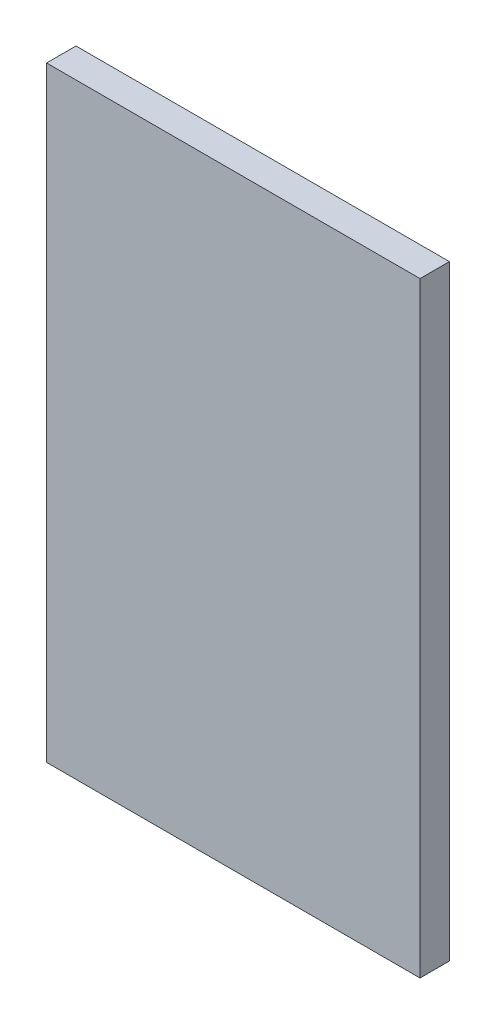
ISO-10303-21;
HEADER;
FILE_DESCRIPTION(('STEP AP214'),'2;1');
FILE_NAME('part.step','',(''),(''),'','','');
FILE_SCHEMA(('AUTOMOTIVE_DESIGN { 1 0 10303 214 1 1 1 1 }'));
ENDSEC;
DATA;
#1=APPLICATION_CONTEXT('core data for automotive mechanical design processes');
#2=APPLICATION_PROTOCOL_DEFINITION('international standard','automotive_design',2000,#1);
#3=PRODUCT_CONTEXT('',#1,'mechanical');
#4=PRODUCT('Part','Part','',(#3));
#5=PRODUCT_RELATED_PRODUCT_CATEGORY('part','',(#4));
#6=PRODUCT_DEFINITION_FORMATION('','',#4);
#7=PRODUCT_DEFINITION_CONTEXT('part definition',#1,'design');
#8=PRODUCT_DEFINITION('design','',#6,#7);
#9=PRODUCT_DEFINITION_SHAPE('','',#8);
#10=(LENGTH_UNIT() NAMED_UNIT(*) SI_UNIT(.MILLI.,.METRE.));
#11=(NAMED_UNIT(*) PLANE_ANGLE_UNIT() SI_UNIT($,.RADIAN.));
#12=(NAMED_UNIT(*) SI_UNIT($,.STERADIAN.) SOLID_ANGLE_UNIT());
#13=UNCERTAINTY_MEASURE_WITH_UNIT(LENGTH_MEASURE(1.E-05),#10,'distance_accuracy_value','');
#14=(GEOMETRIC_REPRESENTATION_CONTEXT(3) GLOBAL_UNCERTAINTY_ASSIGNED_CONTEXT((#13)) GLOBAL_UNIT_ASSIGNED_CONTEXT((#10,
#11,#12)) REPRESENTATION_CONTEXT('',''));
#15=CARTESIAN_POINT('',(0.,0.,0.));
#16=DIRECTION('',(0.,0.,1.));
#17=DIRECTION('',(1.,0.,0.));
#18=AXIS2_PLACEMENT_3D('',#15,#16,#17);
#19=CARTESIAN_POINT('',(216.5,-85.5,-80.));
#20=DIRECTION('',(0.,0.,1.));
#21=DIRECTION('',(1.,0.,0.));
#22=AXIS2_PLACEMENT_3D('',#19,#20,#21);
#23=PLANE('',#22);
#24=DIRECTION('',(0.,1.,0.));
#25=VECTOR('',#24,1.);
#26=CARTESIAN_POINT('',(216.5,-85.5,-80.));
#27=LINE('',#26,#25);
#28=CARTESIAN_POINT('',(216.5,-85.5,-80.));
#29=VERTEX_POINT('',#28);
#30=CARTESIAN_POINT('',(216.5,120.5,-80.));
#31=VERTEX_POINT('',#30);
#32=EDGE_CURVE('E84',#29,#31,#27,.T.);
#33=ORIENTED_EDGE('',*,*,#32,.F.);
#34=DIRECTION('',(1.,0.,0.));
#35=VECTOR('',#34,1.);
#36=CARTESIAN_POINT('',(216.5,-85.5,-80.));
#37=LINE('',#36,#35);
#38=CARTESIAN_POINT('',(343.5,-85.5,-80.));
#39=VERTEX_POINT('',#38);
#40=EDGE_CURVE('E68',#29,#39,#37,.T.);
#41=ORIENTED_EDGE('',*,*,#40,.T.);
#42=DIRECTION('',(0.,1.,0.));
#43=VECTOR('',#42,1.);
#44=CARTESIAN_POINT('',(343.5,-85.5,-80.));
#45=LINE('',#44,#43);
#46=CARTESIAN_POINT('',(343.5,120.5,-80.));
#47=VERTEX_POINT('',#46);
#48=EDGE_CURVE('E79',#39,#47,#45,.T.);
#49=ORIENTED_EDGE('',*,*,#48,.T.);
#50=DIRECTION('',(1.,0.,0.));
#51=VECTOR('',#50,1.);
#52=CARTESIAN_POINT('',(216.5,120.5,-80.));
#53=LINE('',#52,#51);
#54=EDGE_CURVE('E9',#31,#47,#53,.T.);
#55=ORIENTED_EDGE('',*,*,#54,.F.);
#56=EDGE_LOOP('',(#33,#41,#49,#55));
#57=FACE_BOUND('',#56,.T.);
#58=ADVANCED_FACE('F15',(#57),#23,.T.);
#59=CARTESIAN_POINT('',(216.5,-85.5,-90.));
#60=DIRECTION('',(0.,0.,1.));
#61=DIRECTION('',(1.,0.,0.));
#62=AXIS2_PLACEMENT_3D('',#59,#60,#61);
#63=PLANE('',#62);
#64=DIRECTION('',(1.,0.,0.));
#65=VECTOR('',#64,1.);
#66=CARTESIAN_POINT('',(216.5,120.5,-90.));
#67=LINE('',#66,#65);
#68=CARTESIAN_POINT('',(216.5,120.5,-90.));
#69=VERTEX_POINT('',#68);
#70=CARTESIAN_POINT('',(343.5,120.5,-90.));
#71=VERTEX_POINT('',#70);
#72=EDGE_CURVE('E23',#69,#71,#67,.T.);
#73=ORIENTED_EDGE('',*,*,#72,.T.);
#74=DIRECTION('',(0.,1.,0.));
#75=VECTOR('',#74,1.);
#76=CARTESIAN_POINT('',(343.5,-85.5,-90.));
#77=LINE('',#76,#75);
#78=CARTESIAN_POINT('',(343.5,-85.5,-90.));
#79=VERTEX_POINT('',#78);
#80=EDGE_CURVE('E101',#79,#71,#77,.T.);
#81=ORIENTED_EDGE('',*,*,#80,.F.);
#82=DIRECTION('',(1.,0.,0.));
#83=VECTOR('',#82,1.);
#84=CARTESIAN_POINT('',(216.5,-85.5,-90.));
#85=LINE('',#84,#83);
#86=CARTESIAN_POINT('',(216.5,-85.5,-90.));
#87=VERTEX_POINT('',#86);
#88=EDGE_CURVE('E78',#87,#79,#85,.T.);
#89=ORIENTED_EDGE('',*,*,#88,.F.);
#90=DIRECTION('',(0.,1.,0.));
#91=VECTOR('',#90,1.);
#92=CARTESIAN_POINT('',(216.5,-85.5,-90.));
#93=LINE('',#92,#91);
#94=EDGE_CURVE('E88',#87,#69,#93,.T.);
#95=ORIENTED_EDGE('',*,*,#94,.T.);
#96=EDGE_LOOP('',(#73,#81,#89,#95));
#97=FACE_BOUND('',#96,.T.);
#98=ADVANCED_FACE('F120',(#97),#63,.F.);
#99=CARTESIAN_POINT('',(216.5,120.5,-90.));
#100=DIRECTION('',(0.,1.,0.));
#101=DIRECTION('',(1.,0.,0.));
#102=AXIS2_PLACEMENT_3D('',#99,#100,#101);
#103=PLANE('',#102);
#104=ORIENTED_EDGE('',*,*,#72,.F.);
#105=DIRECTION('',(0.,0.,1.));
#106=VECTOR('',#105,1.);
#107=CARTESIAN_POINT('',(216.5,120.5,-90.));
#108=LINE('',#107,#106);
#109=EDGE_CURVE('E89',#69,#31,#108,.T.);
#110=ORIENTED_EDGE('',*,*,#109,.T.);
#111=ORIENTED_EDGE('',*,*,#54,.T.);
#112=DIRECTION('',(0.,0.,1.));
#113=VECTOR('',#112,1.);
#114=CARTESIAN_POINT('',(343.5,120.5,-90.));
#115=LINE('',#114,#113);
#116=EDGE_CURVE('E99',#71,#47,#115,.T.);
#117=ORIENTED_EDGE('',*,*,#116,.F.);
#118=EDGE_LOOP('',(#104,#110,#111,#117));
#119=FACE_BOUND('',#118,.T.);
#120=ADVANCED_FACE('F124',(#119),#103,.T.);
#121=CARTESIAN_POINT('',(216.5,-85.5,-90.));
#122=DIRECTION('',(0.,1.,0.));
#123=DIRECTION('',(1.,0.,0.));
#124=AXIS2_PLACEMENT_3D('',#121,#122,#123);
#125=PLANE('',#124);
#126=DIRECTION('',(0.,0.,1.));
#127=VECTOR('',#126,1.);
#128=CARTESIAN_POINT('',(343.5,-85.5,-90.));
#129=LINE('',#128,#127);
#130=EDGE_CURVE('E72',#79,#39,#129,.T.);
#131=ORIENTED_EDGE('',*,*,#130,.T.);
#132=ORIENTED_EDGE('',*,*,#40,.F.);
#133=DIRECTION('',(0.,0.,1.));
#134=VECTOR('',#133,1.);
#135=CARTESIAN_POINT('',(216.5,-85.5,-90.));
#136=LINE('',#135,#134);
#137=EDGE_CURVE('E75',#87,#29,#136,.T.);
#138=ORIENTED_EDGE('',*,*,#137,.F.);
#139=ORIENTED_EDGE('',*,*,#88,.T.);
#140=EDGE_LOOP('',(#131,#132,#138,#139));
#141=FACE_BOUND('',#140,.T.);
#142=ADVANCED_FACE('F69',(#141),#125,.F.);
#143=CARTESIAN_POINT('',(343.5,-85.5,-90.));
#144=DIRECTION('',(1.,0.,0.));
#145=DIRECTION('',(0.,1.,0.));
#146=AXIS2_PLACEMENT_3D('',#143,#144,#145);
#147=PLANE('',#146);
#148=ORIENTED_EDGE('',*,*,#130,.F.);
#149=ORIENTED_EDGE('',*,*,#80,.T.);
#150=ORIENTED_EDGE('',*,*,#116,.T.);
#151=ORIENTED_EDGE('',*,*,#48,.F.);
#152=EDGE_LOOP('',(#148,#149,#150,#151));
#153=FACE_BOUND('',#152,.T.);
#154=ADVANCED_FACE('F141',(#153),#147,.T.);
#155=CARTESIAN_POINT('',(216.5,-85.5,-90.));
#156=DIRECTION('',(1.,0.,0.));
#157=DIRECTION('',(0.,1.,0.));
#158=AXIS2_PLACEMENT_3D('',#155,#156,#157);
#159=PLANE('',#158);
#160=ORIENTED_EDGE('',*,*,#32,.T.);
#161=ORIENTED_EDGE('',*,*,#109,.F.);
#162=ORIENTED_EDGE('',*,*,#94,.F.);
#163=ORIENTED_EDGE('',*,*,#137,.T.);
#164=EDGE_LOOP('',(#160,#161,#162,#163));
#165=FACE_BOUND('',#164,.T.);
#166=ADVANCED_FACE('F83',(#165),#159,.F.);
#167=CLOSED_SHELL('',(#58,#98,#120,#142,#154,#166));
#168=MANIFOLD_SOLID_BREP('B1',#167);
#169=ADVANCED_BREP_SHAPE_REPRESENTATION('',(#18,#168),#14);
#170=SHAPE_DEFINITION_REPRESENTATION(#9,#169);
ENDSEC;
END-ISO-10303-21;
